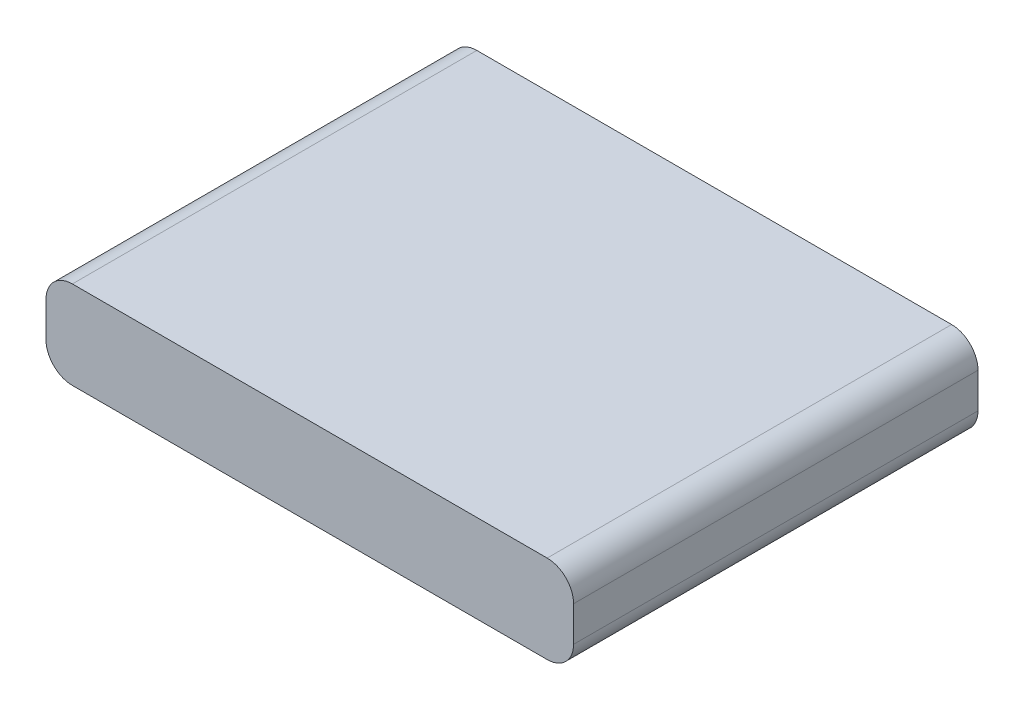
ISO-10303-21;
HEADER;
FILE_DESCRIPTION(('STEP AP214'),'2;1');
FILE_NAME('part.step','',(''),(''),'','','');
FILE_SCHEMA(('AUTOMOTIVE_DESIGN { 1 0 10303 214 1 1 1 1 }'));
ENDSEC;
DATA;
#1=APPLICATION_CONTEXT('core data for automotive mechanical design processes');
#2=APPLICATION_PROTOCOL_DEFINITION('international standard','automotive_design',2000,#1);
#3=PRODUCT_CONTEXT('',#1,'mechanical');
#4=PRODUCT('Part','Part','',(#3));
#5=PRODUCT_RELATED_PRODUCT_CATEGORY('part','',(#4));
#6=PRODUCT_DEFINITION_FORMATION('','',#4);
#7=PRODUCT_DEFINITION_CONTEXT('part definition',#1,'design');
#8=PRODUCT_DEFINITION('design','',#6,#7);
#9=PRODUCT_DEFINITION_SHAPE('','',#8);
#10=(LENGTH_UNIT() NAMED_UNIT(*) SI_UNIT(.MILLI.,.METRE.));
#11=(NAMED_UNIT(*) PLANE_ANGLE_UNIT() SI_UNIT($,.RADIAN.));
#12=(NAMED_UNIT(*) SI_UNIT($,.STERADIAN.) SOLID_ANGLE_UNIT());
#13=UNCERTAINTY_MEASURE_WITH_UNIT(LENGTH_MEASURE(1.E-05),#10,'distance_accuracy_value','');
#14=(GEOMETRIC_REPRESENTATION_CONTEXT(3) GLOBAL_UNCERTAINTY_ASSIGNED_CONTEXT((#13)) GLOBAL_UNIT_ASSIGNED_CONTEXT((#10,
#11,#12)) REPRESENTATION_CONTEXT('',''));
#15=CARTESIAN_POINT('',(0.,0.,0.));
#16=DIRECTION('',(0.,0.,1.));
#17=DIRECTION('',(1.,0.,0.));
#18=AXIS2_PLACEMENT_3D('',#15,#16,#17);
#19=CARTESIAN_POINT('',(-27.,3.,23.));
#20=DIRECTION('',(0.,0.,-1.));
#21=DIRECTION('',(-1.,0.,0.));
#22=AXIS2_PLACEMENT_3D('',#19,#20,#21);
#23=CYLINDRICAL_SURFACE('',#22,3.);
#24=CARTESIAN_POINT('',(-27.,3.,-23.));
#25=DIRECTION('',(0.,0.,1.));
#26=DIRECTION('',(1.,0.,0.));
#27=AXIS2_PLACEMENT_3D('',#24,#25,#26);
#28=CIRCLE('',#27,3.);
#29=CARTESIAN_POINT('',(-30.,3.,-23.));
#30=VERTEX_POINT('',#29);
#31=CARTESIAN_POINT('',(-27.,0.,-23.));
#32=VERTEX_POINT('',#31);
#33=EDGE_CURVE('E135',#30,#32,#28,.T.);
#34=ORIENTED_EDGE('',*,*,#33,.T.);
#35=DIRECTION('',(0.,0.,-1.));
#36=VECTOR('',#35,1.);
#37=CARTESIAN_POINT('',(-27.,0.,23.));
#38=LINE('',#37,#36);
#39=CARTESIAN_POINT('',(-27.,0.,23.));
#40=VERTEX_POINT('',#39);
#41=EDGE_CURVE('E11',#40,#32,#38,.T.);
#42=ORIENTED_EDGE('',*,*,#41,.F.);
#43=CARTESIAN_POINT('',(-27.,3.,23.));
#44=DIRECTION('',(0.,0.,1.));
#45=DIRECTION('',(1.,0.,0.));
#46=AXIS2_PLACEMENT_3D('',#43,#44,#45);
#47=CIRCLE('',#46,3.);
#48=CARTESIAN_POINT('',(-30.,3.,23.));
#49=VERTEX_POINT('',#48);
#50=EDGE_CURVE('E150',#49,#40,#47,.T.);
#51=ORIENTED_EDGE('',*,*,#50,.F.);
#52=DIRECTION('',(0.,0.,-1.));
#53=VECTOR('',#52,1.);
#54=CARTESIAN_POINT('',(-30.,3.,23.));
#55=LINE('',#54,#53);
#56=EDGE_CURVE('E131',#49,#30,#55,.T.);
#57=ORIENTED_EDGE('',*,*,#56,.T.);
#58=EDGE_LOOP('',(#34,#42,#51,#57));
#59=FACE_BOUND('',#58,.T.);
#60=ADVANCED_FACE('F39',(#59),#23,.T.);
#61=CARTESIAN_POINT('',(-27.,0.,23.));
#62=DIRECTION('',(0.,1.,0.));
#63=DIRECTION('',(0.,0.,1.));
#64=AXIS2_PLACEMENT_3D('',#61,#62,#63);
#65=PLANE('',#64);
#66=CARTESIAN_POINT('',(12.,0.,17.5));
#67=DIRECTION('',(0.,1.,0.));
#68=DIRECTION('',(0.,0.,1.));
#69=AXIS2_PLACEMENT_3D('',#66,#67,#68);
#70=CIRCLE('',#69,2.);
#71=CARTESIAN_POINT('',(12.,0.,19.5));
#72=VERTEX_POINT('',#71);
#73=EDGE_CURVE('E189',#72,#72,#70,.T.);
#74=ORIENTED_EDGE('',*,*,#73,.T.);
#75=EDGE_LOOP('',(#74));
#76=FACE_BOUND('',#75,.T.);
#77=CARTESIAN_POINT('',(-12.,0.,-17.5));
#78=DIRECTION('',(0.,1.,0.));
#79=DIRECTION('',(0.,0.,1.));
#80=AXIS2_PLACEMENT_3D('',#77,#78,#79);
#81=CIRCLE('',#80,2.);
#82=CARTESIAN_POINT('',(-12.,0.,-15.5));
#83=VERTEX_POINT('',#82);
#84=EDGE_CURVE('E186',#83,#83,#81,.T.);
#85=ORIENTED_EDGE('',*,*,#84,.T.);
#86=EDGE_LOOP('',(#85));
#87=FACE_BOUND('',#86,.T.);
#88=DIRECTION('',(1.,0.,0.));
#89=VECTOR('',#88,1.);
#90=CARTESIAN_POINT('',(-27.,0.,-23.));
#91=LINE('',#90,#89);
#92=CARTESIAN_POINT('',(27.,0.,-23.));
#93=VERTEX_POINT('',#92);
#94=EDGE_CURVE('E138',#32,#93,#91,.T.);
#95=ORIENTED_EDGE('',*,*,#94,.T.);
#96=DIRECTION('',(0.,0.,-1.));
#97=VECTOR('',#96,1.);
#98=CARTESIAN_POINT('',(27.,0.,23.));
#99=LINE('',#98,#97);
#100=CARTESIAN_POINT('',(27.,0.,23.));
#101=VERTEX_POINT('',#100);
#102=EDGE_CURVE('E47',#101,#93,#99,.T.);
#103=ORIENTED_EDGE('',*,*,#102,.F.);
#104=DIRECTION('',(1.,0.,0.));
#105=VECTOR('',#104,1.);
#106=CARTESIAN_POINT('',(-27.,0.,23.));
#107=LINE('',#106,#105);
#108=EDGE_CURVE('E98',#40,#101,#107,.T.);
#109=ORIENTED_EDGE('',*,*,#108,.F.);
#110=ORIENTED_EDGE('',*,*,#41,.T.);
#111=EDGE_LOOP('',(#95,#103,#109,#110));
#112=FACE_BOUND('',#111,.T.);
#113=ADVANCED_FACE('F207',(#76,#87,#112),#65,.F.);
#114=CARTESIAN_POINT('',(27.,3.,23.));
#115=DIRECTION('',(0.,0.,-1.));
#116=DIRECTION('',(-1.,0.,0.));
#117=AXIS2_PLACEMENT_3D('',#114,#115,#116);
#118=CYLINDRICAL_SURFACE('',#117,3.);
#119=CARTESIAN_POINT('',(27.,3.,-23.));
#120=DIRECTION('',(0.,0.,1.));
#121=DIRECTION('',(1.,0.,0.));
#122=AXIS2_PLACEMENT_3D('',#119,#120,#121);
#123=CIRCLE('',#122,3.);
#124=CARTESIAN_POINT('',(30.,3.,-23.));
#125=VERTEX_POINT('',#124);
#126=EDGE_CURVE('E141',#93,#125,#123,.T.);
#127=ORIENTED_EDGE('',*,*,#126,.T.);
#128=DIRECTION('',(0.,0.,-1.));
#129=VECTOR('',#128,1.);
#130=CARTESIAN_POINT('',(30.,3.,23.));
#131=LINE('',#130,#129);
#132=CARTESIAN_POINT('',(30.,3.,23.));
#133=VERTEX_POINT('',#132);
#134=EDGE_CURVE('E157',#133,#125,#131,.T.);
#135=ORIENTED_EDGE('',*,*,#134,.F.);
#136=CARTESIAN_POINT('',(27.,3.,23.));
#137=DIRECTION('',(0.,0.,1.));
#138=DIRECTION('',(1.,0.,0.));
#139=AXIS2_PLACEMENT_3D('',#136,#137,#138);
#140=CIRCLE('',#139,3.);
#141=EDGE_CURVE('E165',#101,#133,#140,.T.);
#142=ORIENTED_EDGE('',*,*,#141,.F.);
#143=ORIENTED_EDGE('',*,*,#102,.T.);
#144=EDGE_LOOP('',(#127,#135,#142,#143));
#145=FACE_BOUND('',#144,.T.);
#146=ADVANCED_FACE('F163',(#145),#118,.T.);
#147=CARTESIAN_POINT('',(30.,3.,23.));
#148=DIRECTION('',(-1.,0.,0.));
#149=DIRECTION('',(0.,0.,1.));
#150=AXIS2_PLACEMENT_3D('',#147,#148,#149);
#151=PLANE('',#150);
#152=DIRECTION('',(0.,1.,0.));
#153=VECTOR('',#152,1.);
#154=CARTESIAN_POINT('',(30.,3.,-23.));
#155=LINE('',#154,#153);
#156=CARTESIAN_POINT('',(30.,7.,-23.));
#157=VERTEX_POINT('',#156);
#158=EDGE_CURVE('E143',#125,#157,#155,.T.);
#159=ORIENTED_EDGE('',*,*,#158,.T.);
#160=DIRECTION('',(0.,0.,-1.));
#161=VECTOR('',#160,1.);
#162=CARTESIAN_POINT('',(30.,7.,23.));
#163=LINE('',#162,#161);
#164=CARTESIAN_POINT('',(30.,7.,23.));
#165=VERTEX_POINT('',#164);
#166=EDGE_CURVE('E154',#165,#157,#163,.T.);
#167=ORIENTED_EDGE('',*,*,#166,.F.);
#168=DIRECTION('',(0.,1.,0.));
#169=VECTOR('',#168,1.);
#170=CARTESIAN_POINT('',(30.,3.,23.));
#171=LINE('',#170,#169);
#172=EDGE_CURVE('E177',#133,#165,#171,.T.);
#173=ORIENTED_EDGE('',*,*,#172,.F.);
#174=ORIENTED_EDGE('',*,*,#134,.T.);
#175=EDGE_LOOP('',(#159,#167,#173,#174));
#176=FACE_BOUND('',#175,.T.);
#177=ADVANCED_FACE('F173',(#176),#151,.F.);
#178=CARTESIAN_POINT('',(27.,7.,23.));
#179=DIRECTION('',(0.,0.,-1.));
#180=DIRECTION('',(-1.,0.,0.));
#181=AXIS2_PLACEMENT_3D('',#178,#179,#180);
#182=CYLINDRICAL_SURFACE('',#181,3.);
#183=CARTESIAN_POINT('',(27.,7.,-23.));
#184=DIRECTION('',(0.,0.,1.));
#185=DIRECTION('',(1.,0.,0.));
#186=AXIS2_PLACEMENT_3D('',#183,#184,#185);
#187=CIRCLE('',#186,3.);
#188=CARTESIAN_POINT('',(27.,10.,-23.));
#189=VERTEX_POINT('',#188);
#190=EDGE_CURVE('E145',#157,#189,#187,.T.);
#191=ORIENTED_EDGE('',*,*,#190,.T.);
#192=DIRECTION('',(0.,0.,-1.));
#193=VECTOR('',#192,1.);
#194=CARTESIAN_POINT('',(27.,10.,23.));
#195=LINE('',#194,#193);
#196=CARTESIAN_POINT('',(27.,10.,23.));
#197=VERTEX_POINT('',#196);
#198=EDGE_CURVE('E126',#197,#189,#195,.T.);
#199=ORIENTED_EDGE('',*,*,#198,.F.);
#200=CARTESIAN_POINT('',(27.,7.,23.));
#201=DIRECTION('',(0.,0.,1.));
#202=DIRECTION('',(1.,0.,0.));
#203=AXIS2_PLACEMENT_3D('',#200,#201,#202);
#204=CIRCLE('',#203,3.);
#205=EDGE_CURVE('E117',#165,#197,#204,.T.);
#206=ORIENTED_EDGE('',*,*,#205,.F.);
#207=ORIENTED_EDGE('',*,*,#166,.T.);
#208=EDGE_LOOP('',(#191,#199,#206,#207));
#209=FACE_BOUND('',#208,.T.);
#210=ADVANCED_FACE('F176',(#209),#182,.T.);
#211=CARTESIAN_POINT('',(27.,10.,23.));
#212=DIRECTION('',(0.,-1.,0.));
#213=DIRECTION('',(0.,0.,-1.));
#214=AXIS2_PLACEMENT_3D('',#211,#212,#213);
#215=PLANE('',#214);
#216=DIRECTION('',(-1.,0.,0.));
#217=VECTOR('',#216,1.);
#218=CARTESIAN_POINT('',(27.,10.,-23.));
#219=LINE('',#218,#217);
#220=CARTESIAN_POINT('',(-27.,10.,-23.));
#221=VERTEX_POINT('',#220);
#222=EDGE_CURVE('E125',#189,#221,#219,.T.);
#223=ORIENTED_EDGE('',*,*,#222,.T.);
#224=DIRECTION('',(0.,0.,-1.));
#225=VECTOR('',#224,1.);
#226=CARTESIAN_POINT('',(-27.,10.,23.));
#227=LINE('',#226,#225);
#228=CARTESIAN_POINT('',(-27.,10.,23.));
#229=VERTEX_POINT('',#228);
#230=EDGE_CURVE('E122',#229,#221,#227,.T.);
#231=ORIENTED_EDGE('',*,*,#230,.F.);
#232=DIRECTION('',(-1.,0.,0.));
#233=VECTOR('',#232,1.);
#234=CARTESIAN_POINT('',(27.,10.,23.));
#235=LINE('',#234,#233);
#236=EDGE_CURVE('E111',#197,#229,#235,.T.);
#237=ORIENTED_EDGE('',*,*,#236,.F.);
#238=ORIENTED_EDGE('',*,*,#198,.T.);
#239=EDGE_LOOP('',(#223,#231,#237,#238));
#240=FACE_BOUND('',#239,.T.);
#241=ADVANCED_FACE('F123',(#240),#215,.F.);
#242=CARTESIAN_POINT('',(-27.,7.,23.));
#243=DIRECTION('',(0.,0.,-1.));
#244=DIRECTION('',(-1.,0.,0.));
#245=AXIS2_PLACEMENT_3D('',#242,#243,#244);
#246=CYLINDRICAL_SURFACE('',#245,3.);
#247=CARTESIAN_POINT('',(-27.,7.,-23.));
#248=DIRECTION('',(0.,0.,1.));
#249=DIRECTION('',(1.,0.,0.));
#250=AXIS2_PLACEMENT_3D('',#247,#248,#249);
#251=CIRCLE('',#250,3.);
#252=CARTESIAN_POINT('',(-30.,7.,-23.));
#253=VERTEX_POINT('',#252);
#254=EDGE_CURVE('E84',#221,#253,#251,.T.);
#255=ORIENTED_EDGE('',*,*,#254,.T.);
#256=DIRECTION('',(0.,0.,-1.));
#257=VECTOR('',#256,1.);
#258=CARTESIAN_POINT('',(-30.,7.,23.));
#259=LINE('',#258,#257);
#260=CARTESIAN_POINT('',(-30.,7.,23.));
#261=VERTEX_POINT('',#260);
#262=EDGE_CURVE('E127',#261,#253,#259,.T.);
#263=ORIENTED_EDGE('',*,*,#262,.F.);
#264=CARTESIAN_POINT('',(-27.,7.,23.));
#265=DIRECTION('',(0.,0.,1.));
#266=DIRECTION('',(1.,0.,0.));
#267=AXIS2_PLACEMENT_3D('',#264,#265,#266);
#268=CIRCLE('',#267,3.);
#269=EDGE_CURVE('E115',#229,#261,#268,.T.);
#270=ORIENTED_EDGE('',*,*,#269,.F.);
#271=ORIENTED_EDGE('',*,*,#230,.T.);
#272=EDGE_LOOP('',(#255,#263,#270,#271));
#273=FACE_BOUND('',#272,.T.);
#274=ADVANCED_FACE('F129',(#273),#246,.T.);
#275=CARTESIAN_POINT('',(-30.,7.,23.));
#276=DIRECTION('',(1.,0.,0.));
#277=DIRECTION('',(0.,0.,-1.));
#278=AXIS2_PLACEMENT_3D('',#275,#276,#277);
#279=PLANE('',#278);
#280=DIRECTION('',(0.,-1.,0.));
#281=VECTOR('',#280,1.);
#282=CARTESIAN_POINT('',(-30.,7.,-23.));
#283=LINE('',#282,#281);
#284=EDGE_CURVE('E90',#253,#30,#283,.T.);
#285=ORIENTED_EDGE('',*,*,#284,.T.);
#286=ORIENTED_EDGE('',*,*,#56,.F.);
#287=DIRECTION('',(0.,-1.,0.));
#288=VECTOR('',#287,1.);
#289=CARTESIAN_POINT('',(-30.,7.,23.));
#290=LINE('',#289,#288);
#291=EDGE_CURVE('E55',#261,#49,#290,.T.);
#292=ORIENTED_EDGE('',*,*,#291,.F.);
#293=ORIENTED_EDGE('',*,*,#262,.T.);
#294=EDGE_LOOP('',(#285,#286,#292,#293));
#295=FACE_BOUND('',#294,.T.);
#296=ADVANCED_FACE('F216',(#295),#279,.F.);
#297=CARTESIAN_POINT('',(-27.,3.,23.));
#298=DIRECTION('',(0.,0.,1.));
#299=DIRECTION('',(1.,0.,0.));
#300=AXIS2_PLACEMENT_3D('',#297,#298,#299);
#301=PLANE('',#300);
#302=ORIENTED_EDGE('',*,*,#50,.T.);
#303=ORIENTED_EDGE('',*,*,#108,.T.);
#304=ORIENTED_EDGE('',*,*,#141,.T.);
#305=ORIENTED_EDGE('',*,*,#172,.T.);
#306=ORIENTED_EDGE('',*,*,#205,.T.);
#307=ORIENTED_EDGE('',*,*,#236,.T.);
#308=ORIENTED_EDGE('',*,*,#269,.T.);
#309=ORIENTED_EDGE('',*,*,#291,.T.);
#310=EDGE_LOOP('',(#302,#303,#304,#305,#306,#307,#308,#309));
#311=FACE_BOUND('',#310,.T.);
#312=ADVANCED_FACE('F113',(#311),#301,.T.);
#313=CARTESIAN_POINT('',(-27.,3.,-23.));
#314=DIRECTION('',(0.,0.,1.));
#315=DIRECTION('',(1.,0.,0.));
#316=AXIS2_PLACEMENT_3D('',#313,#314,#315);
#317=PLANE('',#316);
#318=ORIENTED_EDGE('',*,*,#33,.F.);
#319=ORIENTED_EDGE('',*,*,#284,.F.);
#320=ORIENTED_EDGE('',*,*,#254,.F.);
#321=ORIENTED_EDGE('',*,*,#222,.F.);
#322=ORIENTED_EDGE('',*,*,#190,.F.);
#323=ORIENTED_EDGE('',*,*,#158,.F.);
#324=ORIENTED_EDGE('',*,*,#126,.F.);
#325=ORIENTED_EDGE('',*,*,#94,.F.);
#326=EDGE_LOOP('',(#318,#319,#320,#321,#322,#323,#324,#325));
#327=FACE_BOUND('',#326,.T.);
#328=ADVANCED_FACE('F169',(#327),#317,.F.);
#329=CARTESIAN_POINT('',(-12.,7.5,-17.5));
#330=DIRECTION('',(0.,-1.,0.));
#331=DIRECTION('',(0.,0.,-1.));
#332=AXIS2_PLACEMENT_3D('',#329,#330,#331);
#333=CYLINDRICAL_SURFACE('',#332,2.);
#334=CARTESIAN_POINT('',(-12.,7.5,-17.5));
#335=DIRECTION('',(0.,1.,0.));
#336=DIRECTION('',(0.,0.,1.));
#337=AXIS2_PLACEMENT_3D('',#334,#335,#336);
#338=CIRCLE('',#337,2.);
#339=CARTESIAN_POINT('',(-12.,7.5,-15.5));
#340=VERTEX_POINT('',#339);
#341=EDGE_CURVE('E183',#340,#340,#338,.T.);
#342=ORIENTED_EDGE('',*,*,#341,.T.);
#343=EDGE_LOOP('',(#342));
#344=FACE_BOUND('',#343,.T.);
#345=ORIENTED_EDGE('',*,*,#84,.F.);
#346=EDGE_LOOP('',(#345));
#347=FACE_BOUND('',#346,.T.);
#348=ADVANCED_FACE('F276',(#344,#347),#333,.F.);
#349=CARTESIAN_POINT('',(-12.,7.5,-17.5));
#350=DIRECTION('',(0.,1.,0.));
#351=DIRECTION('',(0.,0.,1.));
#352=AXIS2_PLACEMENT_3D('',#349,#350,#351);
#353=PLANE('',#352);
#354=ORIENTED_EDGE('',*,*,#341,.F.);
#355=EDGE_LOOP('',(#354));
#356=FACE_BOUND('',#355,.T.);
#357=ADVANCED_FACE('F204',(#356),#353,.F.);
#358=CARTESIAN_POINT('',(12.,7.5,17.5));
#359=DIRECTION('',(0.,-1.,0.));
#360=DIRECTION('',(0.,0.,-1.));
#361=AXIS2_PLACEMENT_3D('',#358,#359,#360);
#362=CYLINDRICAL_SURFACE('',#361,2.);
#363=CARTESIAN_POINT('',(12.,7.5,17.5));
#364=DIRECTION('',(0.,1.,0.));
#365=DIRECTION('',(0.,0.,1.));
#366=AXIS2_PLACEMENT_3D('',#363,#364,#365);
#367=CIRCLE('',#366,2.);
#368=CARTESIAN_POINT('',(12.,7.5,19.5));
#369=VERTEX_POINT('',#368);
#370=EDGE_CURVE('E139',#369,#369,#367,.T.);
#371=ORIENTED_EDGE('',*,*,#370,.T.);
#372=EDGE_LOOP('',(#371));
#373=FACE_BOUND('',#372,.T.);
#374=ORIENTED_EDGE('',*,*,#73,.F.);
#375=EDGE_LOOP('',(#374));
#376=FACE_BOUND('',#375,.T.);
#377=ADVANCED_FACE('F195',(#373,#376),#362,.F.);
#378=CARTESIAN_POINT('',(12.,7.5,17.5));
#379=DIRECTION('',(0.,1.,0.));
#380=DIRECTION('',(0.,0.,1.));
#381=AXIS2_PLACEMENT_3D('',#378,#379,#380);
#382=PLANE('',#381);
#383=ORIENTED_EDGE('',*,*,#370,.F.);
#384=EDGE_LOOP('',(#383));
#385=FACE_BOUND('',#384,.T.);
#386=ADVANCED_FACE('F198',(#385),#382,.F.);
#387=CLOSED_SHELL('',(#60,#113,#146,#177,#210,#241,#274,#296,#312,#328,#348,#357,#377,#386));
#388=MANIFOLD_SOLID_BREP('B2',#387);
#389=ADVANCED_BREP_SHAPE_REPRESENTATION('',(#18,#388),#14);
#390=SHAPE_DEFINITION_REPRESENTATION(#9,#389);
ENDSEC;
END-ISO-10303-21;
